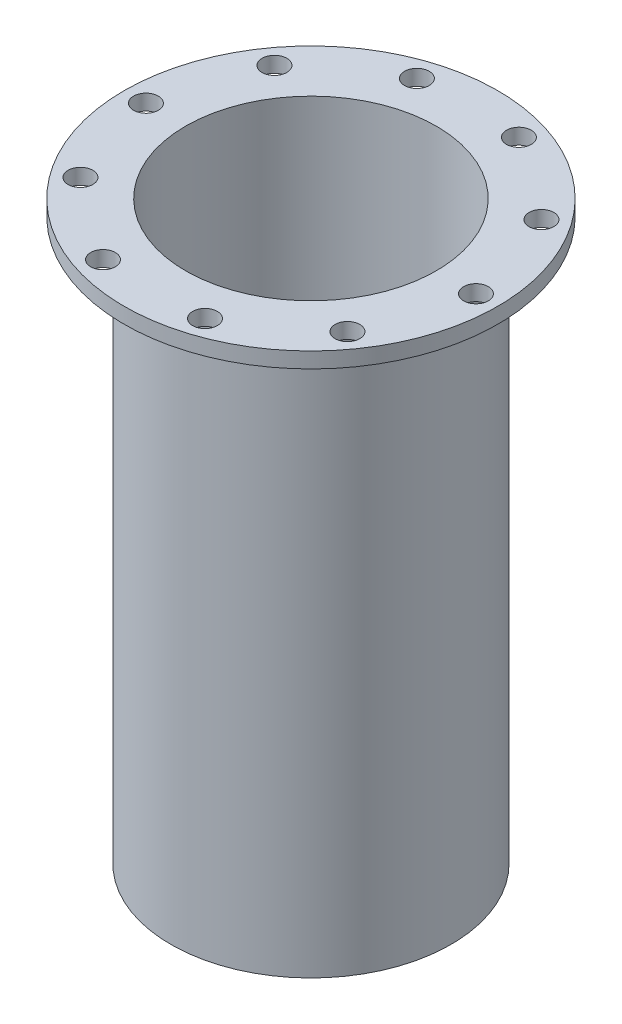
ISO-10303-21;
HEADER;
FILE_DESCRIPTION(('STEP AP214'),'2;1');
FILE_NAME('part.step','',(''),(''),'','','');
FILE_SCHEMA(('AUTOMOTIVE_DESIGN { 1 0 10303 214 1 1 1 1 }'));
ENDSEC;
DATA;
#1=APPLICATION_CONTEXT('core data for automotive mechanical design processes');
#2=APPLICATION_PROTOCOL_DEFINITION('international standard','automotive_design',2000,#1);
#3=PRODUCT_CONTEXT('',#1,'mechanical');
#4=PRODUCT('Part','Part','',(#3));
#5=PRODUCT_RELATED_PRODUCT_CATEGORY('part','',(#4));
#6=PRODUCT_DEFINITION_FORMATION('','',#4);
#7=PRODUCT_DEFINITION_CONTEXT('part definition',#1,'design');
#8=PRODUCT_DEFINITION('design','',#6,#7);
#9=PRODUCT_DEFINITION_SHAPE('','',#8);
#10=(LENGTH_UNIT() NAMED_UNIT(*) SI_UNIT(.MILLI.,.METRE.));
#11=(NAMED_UNIT(*) PLANE_ANGLE_UNIT() SI_UNIT($,.RADIAN.));
#12=(NAMED_UNIT(*) SI_UNIT($,.STERADIAN.) SOLID_ANGLE_UNIT());
#13=UNCERTAINTY_MEASURE_WITH_UNIT(LENGTH_MEASURE(1.E-05),#10,'distance_accuracy_value','');
#14=(GEOMETRIC_REPRESENTATION_CONTEXT(3) GLOBAL_UNCERTAINTY_ASSIGNED_CONTEXT((#13)) GLOBAL_UNIT_ASSIGNED_CONTEXT((#10,
#11,#12)) REPRESENTATION_CONTEXT('',''));
#15=CARTESIAN_POINT('',(0.,0.,0.));
#16=DIRECTION('',(0.,0.,1.));
#17=DIRECTION('',(1.,0.,0.));
#18=AXIS2_PLACEMENT_3D('',#15,#16,#17);
#19=CARTESIAN_POINT('',(76.2,1.25806636316965E-13,0.));
#20=DIRECTION('',(0.,-1.,0.));
#21=DIRECTION('',(1.,0.,0.));
#22=AXIS2_PLACEMENT_3D('',#19,#20,#21);
#23=PLANE('',#22);
#24=CARTESIAN_POINT('',(54.4549338913782,5.66939445869481E-13,39.5638253318057));
#25=DIRECTION('',(0.,1.,0.));
#26=DIRECTION('',(0.,0.,1.));
#27=AXIS2_PLACEMENT_3D('',#24,#25,#26);
#28=CIRCLE('',#27,5.04189999999997);
#29=CARTESIAN_POINT('',(54.4549338913782,5.66939445869481E-13,44.6057253318056));
#30=VERTEX_POINT('',#29);
#31=EDGE_CURVE('E235',#30,#30,#28,.T.);
#32=ORIENTED_EDGE('',*,*,#31,.F.);
#33=EDGE_LOOP('',(#32));
#34=FACE_BOUND('',#33,.T.);
#35=CARTESIAN_POINT('',(20.7999338913784,2.16470374895981E-13,64.0156141118266));
#36=DIRECTION('',(0.,1.,0.));
#37=DIRECTION('',(0.,0.,1.));
#38=AXIS2_PLACEMENT_3D('',#35,#36,#37);
#39=CIRCLE('',#38,5.04189999999997);
#40=CARTESIAN_POINT('',(20.7999338913784,2.16470374895981E-13,69.0575141118265));
#41=VERTEX_POINT('',#40);
#42=EDGE_CURVE('E95',#41,#41,#39,.T.);
#43=ORIENTED_EDGE('',*,*,#42,.F.);
#44=EDGE_LOOP('',(#43));
#45=FACE_BOUND('',#44,.T.);
#46=CARTESIAN_POINT('',(-54.4549338913774,-5.67202291811973E-13,39.5638253318068));
#47=DIRECTION('',(0.,1.,0.));
#48=DIRECTION('',(0.,0.,1.));
#49=AXIS2_PLACEMENT_3D('',#46,#47,#48);
#50=CIRCLE('',#49,5.04189999999997);
#51=CARTESIAN_POINT('',(-54.4549338913774,-5.67202291811973E-13,44.6057253318068));
#52=VERTEX_POINT('',#51);
#53=EDGE_CURVE('E77',#52,#52,#50,.T.);
#54=ORIENTED_EDGE('',*,*,#53,.F.);
#55=EDGE_LOOP('',(#54));
#56=FACE_BOUND('',#55,.T.);
#57=CARTESIAN_POINT('',(-67.31,-7.01069564918256E-13,0.));
#58=DIRECTION('',(0.,1.,0.));
#59=DIRECTION('',(0.,0.,1.));
#60=AXIS2_PLACEMENT_3D('',#57,#58,#59);
#61=CIRCLE('',#60,5.04189999999997);
#62=CARTESIAN_POINT('',(-67.31,-7.01069564918256E-13,5.04189999999997));
#63=VERTEX_POINT('',#62);
#64=EDGE_CURVE('E73',#63,#63,#61,.T.);
#65=ORIENTED_EDGE('',*,*,#64,.F.);
#66=EDGE_LOOP('',(#65));
#67=FACE_BOUND('',#66,.T.);
#68=CARTESIAN_POINT('',(-54.4549338913779,-5.67202291811979E-13,-39.5638253318061));
#69=DIRECTION('',(0.,1.,0.));
#70=DIRECTION('',(0.,0.,1.));
#71=AXIS2_PLACEMENT_3D('',#68,#69,#70);
#72=CIRCLE('',#71,5.04189999999997);
#73=CARTESIAN_POINT('',(-54.4549338913779,-5.67202291811979E-13,-34.5219253318061));
#74=VERTEX_POINT('',#73);
#75=EDGE_CURVE('E69',#74,#74,#72,.T.);
#76=ORIENTED_EDGE('',*,*,#75,.F.);
#77=EDGE_LOOP('',(#76));
#78=FACE_BOUND('',#77,.T.);
#79=CARTESIAN_POINT('',(-20.799933891378,-2.16733220838477E-13,-64.0156141118267));
#80=DIRECTION('',(0.,1.,0.));
#81=DIRECTION('',(0.,0.,1.));
#82=AXIS2_PLACEMENT_3D('',#79,#80,#81);
#83=CIRCLE('',#82,5.04189999999997);
#84=CARTESIAN_POINT('',(-20.799933891378,-2.16733220838477E-13,-58.9737141118267));
#85=VERTEX_POINT('',#84);
#86=EDGE_CURVE('E68',#85,#85,#83,.T.);
#87=ORIENTED_EDGE('',*,*,#86,.F.);
#88=EDGE_LOOP('',(#87));
#89=FACE_BOUND('',#88,.T.);
#90=CARTESIAN_POINT('',(20.7999338913775,2.16470374895971E-13,-64.0156141118268));
#91=DIRECTION('',(0.,1.,0.));
#92=DIRECTION('',(0.,0.,1.));
#93=AXIS2_PLACEMENT_3D('',#90,#91,#92);
#94=CIRCLE('',#93,5.04189999999997);
#95=CARTESIAN_POINT('',(20.7999338913775,2.16470374895971E-13,-58.9737141118269));
#96=VERTEX_POINT('',#95);
#97=EDGE_CURVE('E110',#96,#96,#94,.T.);
#98=ORIENTED_EDGE('',*,*,#97,.F.);
#99=EDGE_LOOP('',(#98));
#100=FACE_BOUND('',#99,.T.);
#101=CARTESIAN_POINT('',(54.4549338913777,5.66939445869475E-13,-39.5638253318064));
#102=DIRECTION('',(0.,1.,0.));
#103=DIRECTION('',(0.,0.,1.));
#104=AXIS2_PLACEMENT_3D('',#101,#102,#103);
#105=CIRCLE('',#104,5.04189999999997);
#106=CARTESIAN_POINT('',(54.4549338913777,5.66939445869475E-13,-34.5219253318065));
#107=VERTEX_POINT('',#106);
#108=EDGE_CURVE('E63',#107,#107,#105,.T.);
#109=ORIENTED_EDGE('',*,*,#108,.F.);
#110=EDGE_LOOP('',(#109));
#111=FACE_BOUND('',#110,.T.);
#112=CARTESIAN_POINT('',(67.31,7.00806718975755E-13,0.));
#113=DIRECTION('',(0.,1.,0.));
#114=DIRECTION('',(0.,0.,1.));
#115=AXIS2_PLACEMENT_3D('',#112,#113,#114);
#116=CIRCLE('',#115,5.04189999999997);
#117=CARTESIAN_POINT('',(67.31,7.00806718975755E-13,5.04189999999997));
#118=VERTEX_POINT('',#117);
#119=EDGE_CURVE('E62',#118,#118,#116,.T.);
#120=ORIENTED_EDGE('',*,*,#119,.F.);
#121=EDGE_LOOP('',(#120));
#122=FACE_BOUND('',#121,.T.);
#123=CARTESIAN_POINT('',(0.,-5.38710126497475E-13,0.));
#124=DIRECTION('',(0.,1.,0.));
#125=DIRECTION('',(-1.,0.,0.));
#126=AXIS2_PLACEMENT_3D('',#123,#124,#125);
#127=CIRCLE('',#126,51.1302);
#128=CARTESIAN_POINT('',(-51.1302,-1.07115860941797E-12,0.));
#129=VERTEX_POINT('',#128);
#130=EDGE_CURVE('E10',#129,#129,#127,.T.);
#131=ORIENTED_EDGE('',*,*,#130,.F.);
#132=EDGE_LOOP('',(#131));
#133=FACE_BOUND('',#132,.T.);
#134=CARTESIAN_POINT('',(0.,-7.96706356220305E-13,0.));
#135=DIRECTION('',(0.,1.,0.));
#136=DIRECTION('',(-1.,0.,0.));
#137=AXIS2_PLACEMENT_3D('',#134,#135,#136);
#138=CIRCLE('',#137,76.2);
#139=CARTESIAN_POINT('',(-76.2,-1.59022123389616E-12,0.));
#140=VERTEX_POINT('',#139);
#141=EDGE_CURVE('E124',#140,#140,#138,.T.);
#142=ORIENTED_EDGE('',*,*,#141,.T.);
#143=EDGE_LOOP('',(#142));
#144=FACE_BOUND('',#143,.T.);
#145=CARTESIAN_POINT('',(-20.7999338913771,-2.16733220838468E-13,64.015614111827));
#146=DIRECTION('',(0.,1.,0.));
#147=DIRECTION('',(0.,0.,1.));
#148=AXIS2_PLACEMENT_3D('',#145,#146,#147);
#149=CIRCLE('',#148,5.04189999999997);
#150=CARTESIAN_POINT('',(-20.7999338913771,-2.16733220838468E-13,69.0575141118269));
#151=VERTEX_POINT('',#150);
#152=EDGE_CURVE('E81',#151,#151,#149,.T.);
#153=ORIENTED_EDGE('',*,*,#152,.F.);
#154=EDGE_LOOP('',(#153));
#155=FACE_BOUND('',#154,.T.);
#156=ADVANCED_FACE('F41',(#34,#45,#56,#67,#78,#89,#100,#111,#122,#133,#144,#155),#23,.F.);
#157=CARTESIAN_POINT('',(0.,0.,0.));
#158=DIRECTION('',(0.,1.,0.));
#159=DIRECTION('',(-1.,0.,0.));
#160=AXIS2_PLACEMENT_3D('',#157,#158,#159);
#161=CYLINDRICAL_SURFACE('',#160,51.1301999999989);
#162=CARTESIAN_POINT('',(2.29458052127936E-12,-220.345000000001,0.));
#163=DIRECTION('',(0.,1.,0.));
#164=DIRECTION('',(-1.,0.,0.));
#165=AXIS2_PLACEMENT_3D('',#162,#163,#164);
#166=CIRCLE('',#165,51.1301999999977);
#167=CARTESIAN_POINT('',(-51.1301999999954,-220.345000000002,0.));
#168=VERTEX_POINT('',#167);
#169=EDGE_CURVE('E49',#168,#168,#166,.T.);
#170=ORIENTED_EDGE('',*,*,#169,.F.);
#171=EDGE_LOOP('',(#170));
#172=FACE_BOUND('',#171,.T.);
#173=ORIENTED_EDGE('',*,*,#130,.T.);
#174=EDGE_LOOP('',(#173));
#175=FACE_BOUND('',#174,.T.);
#176=ADVANCED_FACE('F155',(#172,#175),#161,.F.);
#177=CARTESIAN_POINT('',(51.1302,-220.345000000001,0.));
#178=DIRECTION('',(0.,1.,0.));
#179=DIRECTION('',(-1.,0.,0.));
#180=AXIS2_PLACEMENT_3D('',#177,#178,#179);
#181=PLANE('',#180);
#182=CARTESIAN_POINT('',(2.29458052127936E-12,-220.345000000001,0.));
#183=DIRECTION('',(0.,1.,0.));
#184=DIRECTION('',(-1.,0.,0.));
#185=AXIS2_PLACEMENT_3D('',#182,#183,#184);
#186=CIRCLE('',#185,53.6701999999977);
#187=CARTESIAN_POINT('',(-53.6701999999954,-220.345000000002,0.));
#188=VERTEX_POINT('',#187);
#189=EDGE_CURVE('E55',#188,#188,#186,.T.);
#190=ORIENTED_EDGE('',*,*,#189,.F.);
#191=EDGE_LOOP('',(#190));
#192=FACE_BOUND('',#191,.T.);
#193=ORIENTED_EDGE('',*,*,#169,.T.);
#194=EDGE_LOOP('',(#193));
#195=FACE_BOUND('',#194,.T.);
#196=ADVANCED_FACE('F152',(#192,#195),#181,.F.);
#197=CARTESIAN_POINT('',(0.,0.,0.));
#198=DIRECTION('',(0.,1.,0.));
#199=DIRECTION('',(-1.,0.,0.));
#200=AXIS2_PLACEMENT_3D('',#197,#198,#199);
#201=CYLINDRICAL_SURFACE('',#200,53.6701999999977);
#202=CARTESIAN_POINT('',(2.3263211163864E-12,-223.393000000001,0.));
#203=DIRECTION('',(0.,1.,0.));
#204=DIRECTION('',(-1.,0.,0.));
#205=AXIS2_PLACEMENT_3D('',#202,#203,#204);
#206=CIRCLE('',#205,53.6701999999977);
#207=CARTESIAN_POINT('',(-53.6701999999954,-223.393000000002,0.));
#208=VERTEX_POINT('',#207);
#209=EDGE_CURVE('E145',#208,#208,#206,.T.);
#210=ORIENTED_EDGE('',*,*,#209,.F.);
#211=EDGE_LOOP('',(#210));
#212=FACE_BOUND('',#211,.T.);
#213=ORIENTED_EDGE('',*,*,#189,.T.);
#214=EDGE_LOOP('',(#213));
#215=FACE_BOUND('',#214,.T.);
#216=ADVANCED_FACE('F150',(#212,#215),#201,.F.);
#217=CARTESIAN_POINT('',(53.6702,-223.393000000001,0.));
#218=DIRECTION('',(0.,-1.,0.));
#219=DIRECTION('',(1.,0.,0.));
#220=AXIS2_PLACEMENT_3D('',#217,#218,#219);
#221=PLANE('',#220);
#222=CARTESIAN_POINT('',(2.3263211163864E-12,-223.393000000001,0.));
#223=DIRECTION('',(0.,1.,0.));
#224=DIRECTION('',(-1.,0.,0.));
#225=AXIS2_PLACEMENT_3D('',#222,#223,#224);
#226=CIRCLE('',#225,51.1301999999977);
#227=CARTESIAN_POINT('',(-51.1301999999954,-223.393000000002,0.));
#228=VERTEX_POINT('',#227);
#229=EDGE_CURVE('E142',#228,#228,#226,.T.);
#230=ORIENTED_EDGE('',*,*,#229,.F.);
#231=EDGE_LOOP('',(#230));
#232=FACE_BOUND('',#231,.T.);
#233=ORIENTED_EDGE('',*,*,#209,.T.);
#234=EDGE_LOOP('',(#233));
#235=FACE_BOUND('',#234,.T.);
#236=ADVANCED_FACE('F167',(#232,#235),#221,.F.);
#237=CARTESIAN_POINT('',(0.,0.,0.));
#238=DIRECTION('',(0.,1.,0.));
#239=DIRECTION('',(-1.,0.,0.));
#240=AXIS2_PLACEMENT_3D('',#237,#238,#239);
#241=CYLINDRICAL_SURFACE('',#240,51.1301999999976);
#242=CARTESIAN_POINT('',(2.44667087283389E-12,-234.950000000001,0.));
#243=DIRECTION('',(0.,1.,0.));
#244=DIRECTION('',(-1.,0.,0.));
#245=AXIS2_PLACEMENT_3D('',#242,#243,#244);
#246=CIRCLE('',#245,51.1301999999976);
#247=CARTESIAN_POINT('',(-51.1301999999951,-234.950000000001,0.));
#248=VERTEX_POINT('',#247);
#249=EDGE_CURVE('E139',#248,#248,#246,.T.);
#250=ORIENTED_EDGE('',*,*,#249,.F.);
#251=EDGE_LOOP('',(#250));
#252=FACE_BOUND('',#251,.T.);
#253=ORIENTED_EDGE('',*,*,#229,.T.);
#254=EDGE_LOOP('',(#253));
#255=FACE_BOUND('',#254,.T.);
#256=ADVANCED_FACE('F171',(#252,#255),#241,.F.);
#257=CARTESIAN_POINT('',(51.1302,-234.95,0.));
#258=DIRECTION('',(0.,1.,0.));
#259=DIRECTION('',(-1.,0.,0.));
#260=AXIS2_PLACEMENT_3D('',#257,#258,#259);
#261=PLANE('',#260);
#262=CARTESIAN_POINT('',(2.44667087283389E-12,-234.950000000001,0.));
#263=DIRECTION('',(0.,1.,0.));
#264=DIRECTION('',(-1.,0.,0.));
#265=AXIS2_PLACEMENT_3D('',#262,#263,#264);
#266=CIRCLE('',#265,57.1499999999976);
#267=CARTESIAN_POINT('',(-57.1499999999951,-234.950000000001,0.));
#268=VERTEX_POINT('',#267);
#269=EDGE_CURVE('E136',#268,#268,#266,.T.);
#270=ORIENTED_EDGE('',*,*,#269,.F.);
#271=EDGE_LOOP('',(#270));
#272=FACE_BOUND('',#271,.T.);
#273=ORIENTED_EDGE('',*,*,#249,.T.);
#274=EDGE_LOOP('',(#273));
#275=FACE_BOUND('',#274,.T.);
#276=ADVANCED_FACE('F175',(#272,#275),#261,.F.);
#277=CARTESIAN_POINT('',(0.,0.,0.));
#278=DIRECTION('',(0.,1.,0.));
#279=DIRECTION('',(-1.,0.,0.));
#280=AXIS2_PLACEMENT_3D('',#277,#278,#279);
#281=CYLINDRICAL_SURFACE('',#280,57.1499999999988);
#282=CARTESIAN_POINT('',(0.,-6.3500000000006,0.));
#283=DIRECTION('',(0.,1.,0.));
#284=DIRECTION('',(-1.,0.,0.));
#285=AXIS2_PLACEMENT_3D('',#282,#283,#284);
#286=CIRCLE('',#285,57.1499999999999);
#287=CARTESIAN_POINT('',(-57.1499999999999,-6.35000000000119,0.));
#288=VERTEX_POINT('',#287);
#289=EDGE_CURVE('E132',#288,#288,#286,.T.);
#290=ORIENTED_EDGE('',*,*,#289,.F.);
#291=EDGE_LOOP('',(#290));
#292=FACE_BOUND('',#291,.T.);
#293=ORIENTED_EDGE('',*,*,#269,.T.);
#294=EDGE_LOOP('',(#293));
#295=FACE_BOUND('',#294,.T.);
#296=ADVANCED_FACE('F179',(#292,#295),#281,.T.);
#297=CARTESIAN_POINT('',(57.15,-6.3500000000001,0.));
#298=DIRECTION('',(0.,1.,0.));
#299=DIRECTION('',(-1.,0.,0.));
#300=AXIS2_PLACEMENT_3D('',#297,#298,#299);
#301=PLANE('',#300);
#302=CARTESIAN_POINT('',(54.4549338913782,-6.35000000000013,39.5638253318057));
#303=DIRECTION('',(0.,1.,0.));
#304=DIRECTION('',(-1.,0.,0.));
#305=AXIS2_PLACEMENT_3D('',#302,#303,#304);
#306=CIRCLE('',#305,5.04189999999995);
#307=CARTESIAN_POINT('',(49.4130338913783,-6.35000000000018,39.5638253318057));
#308=VERTEX_POINT('',#307);
#309=EDGE_CURVE('E44',#308,#308,#306,.T.);
#310=ORIENTED_EDGE('',*,*,#309,.T.);
#311=EDGE_LOOP('',(#310));
#312=FACE_BOUND('',#311,.T.);
#313=CARTESIAN_POINT('',(20.7999338913784,-6.35000000000048,64.0156141118266));
#314=DIRECTION('',(0.,1.,0.));
#315=DIRECTION('',(-1.,0.,0.));
#316=AXIS2_PLACEMENT_3D('',#313,#314,#315);
#317=CIRCLE('',#316,5.04189999999995);
#318=CARTESIAN_POINT('',(15.7580338913785,-6.35000000000053,64.0156141118266));
#319=VERTEX_POINT('',#318);
#320=EDGE_CURVE('E90',#319,#319,#317,.T.);
#321=ORIENTED_EDGE('',*,*,#320,.T.);
#322=EDGE_LOOP('',(#321));
#323=FACE_BOUND('',#322,.T.);
#324=CARTESIAN_POINT('',(-20.7999338913771,-6.35000000000091,64.015614111827));
#325=DIRECTION('',(0.,1.,0.));
#326=DIRECTION('',(-1.,0.,0.));
#327=AXIS2_PLACEMENT_3D('',#324,#325,#326);
#328=CIRCLE('',#327,5.04189999999995);
#329=CARTESIAN_POINT('',(-25.841833891377,-6.35000000000097,64.015614111827));
#330=VERTEX_POINT('',#329);
#331=EDGE_CURVE('E78',#330,#330,#328,.T.);
#332=ORIENTED_EDGE('',*,*,#331,.T.);
#333=EDGE_LOOP('',(#332));
#334=FACE_BOUND('',#333,.T.);
#335=CARTESIAN_POINT('',(-54.4549338913774,-6.35000000000126,39.5638253318068));
#336=DIRECTION('',(0.,1.,0.));
#337=DIRECTION('',(-1.,0.,0.));
#338=AXIS2_PLACEMENT_3D('',#335,#336,#337);
#339=CIRCLE('',#338,5.04189999999995);
#340=CARTESIAN_POINT('',(-59.4968338913773,-6.35000000000132,39.5638253318068));
#341=VERTEX_POINT('',#340);
#342=EDGE_CURVE('E74',#341,#341,#339,.T.);
#343=ORIENTED_EDGE('',*,*,#342,.T.);
#344=EDGE_LOOP('',(#343));
#345=FACE_BOUND('',#344,.T.);
#346=CARTESIAN_POINT('',(-67.31,-6.3500000000014,0.));
#347=DIRECTION('',(0.,1.,0.));
#348=DIRECTION('',(-1.,0.,0.));
#349=AXIS2_PLACEMENT_3D('',#346,#347,#348);
#350=CIRCLE('',#349,5.04189999999995);
#351=CARTESIAN_POINT('',(-72.3518999999999,-6.35000000000145,0.));
#352=VERTEX_POINT('',#351);
#353=EDGE_CURVE('E70',#352,#352,#350,.T.);
#354=ORIENTED_EDGE('',*,*,#353,.T.);
#355=EDGE_LOOP('',(#354));
#356=FACE_BOUND('',#355,.T.);
#357=CARTESIAN_POINT('',(-54.4549338913779,-6.35000000000126,-39.5638253318061));
#358=DIRECTION('',(0.,1.,0.));
#359=DIRECTION('',(-1.,0.,0.));
#360=AXIS2_PLACEMENT_3D('',#357,#358,#359);
#361=CIRCLE('',#360,5.04189999999995);
#362=CARTESIAN_POINT('',(-59.4968338913779,-6.35000000000132,-39.5638253318061));
#363=VERTEX_POINT('',#362);
#364=EDGE_CURVE('E64',#363,#363,#361,.T.);
#365=ORIENTED_EDGE('',*,*,#364,.T.);
#366=EDGE_LOOP('',(#365));
#367=FACE_BOUND('',#366,.T.);
#368=CARTESIAN_POINT('',(-20.799933891378,-6.35000000000091,-64.0156141118267));
#369=DIRECTION('',(0.,1.,0.));
#370=DIRECTION('',(-1.,0.,0.));
#371=AXIS2_PLACEMENT_3D('',#368,#369,#370);
#372=CIRCLE('',#371,5.04189999999995);
#373=CARTESIAN_POINT('',(-25.8418338913779,-6.35000000000097,-64.0156141118267));
#374=VERTEX_POINT('',#373);
#375=EDGE_CURVE('E106',#374,#374,#372,.T.);
#376=ORIENTED_EDGE('',*,*,#375,.T.);
#377=EDGE_LOOP('',(#376));
#378=FACE_BOUND('',#377,.T.);
#379=CARTESIAN_POINT('',(20.7999338913775,-6.35000000000048,-64.0156141118268));
#380=DIRECTION('',(0.,1.,0.));
#381=DIRECTION('',(-1.,0.,0.));
#382=AXIS2_PLACEMENT_3D('',#379,#380,#381);
#383=CIRCLE('',#382,5.04189999999995);
#384=CARTESIAN_POINT('',(15.7580338913776,-6.35000000000053,-64.0156141118268));
#385=VERTEX_POINT('',#384);
#386=EDGE_CURVE('E113',#385,#385,#383,.T.);
#387=ORIENTED_EDGE('',*,*,#386,.T.);
#388=EDGE_LOOP('',(#387));
#389=FACE_BOUND('',#388,.T.);
#390=CARTESIAN_POINT('',(54.4549338913777,-6.35000000000013,-39.5638253318064));
#391=DIRECTION('',(0.,1.,0.));
#392=DIRECTION('',(-1.,0.,0.));
#393=AXIS2_PLACEMENT_3D('',#390,#391,#392);
#394=CIRCLE('',#393,5.04189999999995);
#395=CARTESIAN_POINT('',(49.4130338913777,-6.35000000000018,-39.5638253318064));
#396=VERTEX_POINT('',#395);
#397=EDGE_CURVE('E59',#396,#396,#394,.T.);
#398=ORIENTED_EDGE('',*,*,#397,.T.);
#399=EDGE_LOOP('',(#398));
#400=FACE_BOUND('',#399,.T.);
#401=CARTESIAN_POINT('',(67.31,-6.35,0.));
#402=DIRECTION('',(0.,1.,0.));
#403=DIRECTION('',(-1.,0.,0.));
#404=AXIS2_PLACEMENT_3D('',#401,#402,#403);
#405=CIRCLE('',#404,5.04189999999996);
#406=CARTESIAN_POINT('',(62.2681,-6.35000000000005,0.));
#407=VERTEX_POINT('',#406);
#408=EDGE_CURVE('E120',#407,#407,#405,.T.);
#409=ORIENTED_EDGE('',*,*,#408,.T.);
#410=EDGE_LOOP('',(#409));
#411=FACE_BOUND('',#410,.T.);
#412=CARTESIAN_POINT('',(0.,-6.3500000000008,0.));
#413=DIRECTION('',(0.,1.,0.));
#414=DIRECTION('',(-1.,0.,0.));
#415=AXIS2_PLACEMENT_3D('',#412,#413,#414);
#416=CIRCLE('',#415,76.1999999999999);
#417=CARTESIAN_POINT('',(-76.1999999999999,-6.35000000000159,0.));
#418=VERTEX_POINT('',#417);
#419=EDGE_CURVE('E128',#418,#418,#416,.T.);
#420=ORIENTED_EDGE('',*,*,#419,.F.);
#421=EDGE_LOOP('',(#420));
#422=FACE_BOUND('',#421,.T.);
#423=ORIENTED_EDGE('',*,*,#289,.T.);
#424=EDGE_LOOP('',(#423));
#425=FACE_BOUND('',#424,.T.);
#426=ADVANCED_FACE('F183',(#312,#323,#334,#345,#356,#367,#378,#389,#400,#411,#422,#425),#301,.F.);
#427=CARTESIAN_POINT('',(0.,0.,0.));
#428=DIRECTION('',(0.,1.,0.));
#429=DIRECTION('',(-1.,0.,0.));
#430=AXIS2_PLACEMENT_3D('',#427,#428,#429);
#431=CYLINDRICAL_SURFACE('',#430,76.2);
#432=ORIENTED_EDGE('',*,*,#141,.F.);
#433=EDGE_LOOP('',(#432));
#434=FACE_BOUND('',#433,.T.);
#435=ORIENTED_EDGE('',*,*,#419,.T.);
#436=EDGE_LOOP('',(#435));
#437=FACE_BOUND('',#436,.T.);
#438=ADVANCED_FACE('F187',(#434,#437),#431,.T.);
#439=CARTESIAN_POINT('',(67.31,7.00938141947005E-13,0.));
#440=DIRECTION('',(0.,1.,0.));
#441=DIRECTION('',(0.,0.,1.));
#442=AXIS2_PLACEMENT_3D('',#439,#440,#441);
#443=CYLINDRICAL_SURFACE('',#442,5.04189999999996);
#444=ORIENTED_EDGE('',*,*,#119,.T.);
#445=EDGE_LOOP('',(#444));
#446=FACE_BOUND('',#445,.T.);
#447=ORIENTED_EDGE('',*,*,#408,.F.);
#448=EDGE_LOOP('',(#447));
#449=FACE_BOUND('',#448,.T.);
#450=ADVANCED_FACE('F191',(#446,#449),#443,.F.);
#451=CARTESIAN_POINT('',(54.4549338913777,5.67070868840726E-13,-39.5638253318064));
#452=DIRECTION('',(0.,1.,0.));
#453=DIRECTION('',(0.,0.,1.));
#454=AXIS2_PLACEMENT_3D('',#451,#452,#453);
#455=CYLINDRICAL_SURFACE('',#454,5.04189999999995);
#456=ORIENTED_EDGE('',*,*,#108,.T.);
#457=EDGE_LOOP('',(#456));
#458=FACE_BOUND('',#457,.T.);
#459=ORIENTED_EDGE('',*,*,#397,.F.);
#460=EDGE_LOOP('',(#459));
#461=FACE_BOUND('',#460,.T.);
#462=ADVANCED_FACE('F195',(#458,#461),#455,.F.);
#463=CARTESIAN_POINT('',(20.7999338913775,2.16601797867222E-13,-64.0156141118268));
#464=DIRECTION('',(0.,1.,0.));
#465=DIRECTION('',(0.,0.,1.));
#466=AXIS2_PLACEMENT_3D('',#463,#464,#465);
#467=CYLINDRICAL_SURFACE('',#466,5.04189999999995);
#468=ORIENTED_EDGE('',*,*,#97,.T.);
#469=EDGE_LOOP('',(#468));
#470=FACE_BOUND('',#469,.T.);
#471=ORIENTED_EDGE('',*,*,#386,.F.);
#472=EDGE_LOOP('',(#471));
#473=FACE_BOUND('',#472,.T.);
#474=ADVANCED_FACE('F199',(#470,#473),#467,.F.);
#475=CARTESIAN_POINT('',(-20.799933891378,-2.16601797867227E-13,-64.0156141118267));
#476=DIRECTION('',(0.,1.,0.));
#477=DIRECTION('',(0.,0.,1.));
#478=AXIS2_PLACEMENT_3D('',#475,#476,#477);
#479=CYLINDRICAL_SURFACE('',#478,5.04189999999995);
#480=ORIENTED_EDGE('',*,*,#86,.T.);
#481=EDGE_LOOP('',(#480));
#482=FACE_BOUND('',#481,.T.);
#483=ORIENTED_EDGE('',*,*,#375,.F.);
#484=EDGE_LOOP('',(#483));
#485=FACE_BOUND('',#484,.T.);
#486=ADVANCED_FACE('F203',(#482,#485),#479,.F.);
#487=CARTESIAN_POINT('',(-54.4549338913779,-5.67070868840729E-13,-39.5638253318061));
#488=DIRECTION('',(0.,1.,0.));
#489=DIRECTION('',(0.,0.,1.));
#490=AXIS2_PLACEMENT_3D('',#487,#488,#489);
#491=CYLINDRICAL_SURFACE('',#490,5.04189999999995);
#492=ORIENTED_EDGE('',*,*,#75,.T.);
#493=EDGE_LOOP('',(#492));
#494=FACE_BOUND('',#493,.T.);
#495=ORIENTED_EDGE('',*,*,#364,.F.);
#496=EDGE_LOOP('',(#495));
#497=FACE_BOUND('',#496,.T.);
#498=ADVANCED_FACE('F207',(#494,#497),#491,.F.);
#499=CARTESIAN_POINT('',(-67.31,-7.00938141947005E-13,0.));
#500=DIRECTION('',(0.,1.,0.));
#501=DIRECTION('',(0.,0.,1.));
#502=AXIS2_PLACEMENT_3D('',#499,#500,#501);
#503=CYLINDRICAL_SURFACE('',#502,5.04189999999995);
#504=ORIENTED_EDGE('',*,*,#64,.T.);
#505=EDGE_LOOP('',(#504));
#506=FACE_BOUND('',#505,.T.);
#507=ORIENTED_EDGE('',*,*,#353,.F.);
#508=EDGE_LOOP('',(#507));
#509=FACE_BOUND('',#508,.T.);
#510=ADVANCED_FACE('F211',(#506,#509),#503,.F.);
#511=CARTESIAN_POINT('',(-54.4549338913774,-5.67070868840723E-13,39.5638253318068));
#512=DIRECTION('',(0.,1.,0.));
#513=DIRECTION('',(0.,0.,1.));
#514=AXIS2_PLACEMENT_3D('',#511,#512,#513);
#515=CYLINDRICAL_SURFACE('',#514,5.04189999999995);
#516=ORIENTED_EDGE('',*,*,#53,.T.);
#517=EDGE_LOOP('',(#516));
#518=FACE_BOUND('',#517,.T.);
#519=ORIENTED_EDGE('',*,*,#342,.F.);
#520=EDGE_LOOP('',(#519));
#521=FACE_BOUND('',#520,.T.);
#522=ADVANCED_FACE('F215',(#518,#521),#515,.F.);
#523=CARTESIAN_POINT('',(-20.7999338913771,-2.16601797867217E-13,64.015614111827));
#524=DIRECTION('',(0.,1.,0.));
#525=DIRECTION('',(0.,0.,1.));
#526=AXIS2_PLACEMENT_3D('',#523,#524,#525);
#527=CYLINDRICAL_SURFACE('',#526,5.04189999999995);
#528=ORIENTED_EDGE('',*,*,#152,.T.);
#529=EDGE_LOOP('',(#528));
#530=FACE_BOUND('',#529,.T.);
#531=ORIENTED_EDGE('',*,*,#331,.F.);
#532=EDGE_LOOP('',(#531));
#533=FACE_BOUND('',#532,.T.);
#534=ADVANCED_FACE('F219',(#530,#533),#527,.F.);
#535=CARTESIAN_POINT('',(20.7999338913784,2.16601797867231E-13,64.0156141118266));
#536=DIRECTION('',(0.,1.,0.));
#537=DIRECTION('',(0.,0.,1.));
#538=AXIS2_PLACEMENT_3D('',#535,#536,#537);
#539=CYLINDRICAL_SURFACE('',#538,5.04189999999995);
#540=ORIENTED_EDGE('',*,*,#42,.T.);
#541=EDGE_LOOP('',(#540));
#542=FACE_BOUND('',#541,.T.);
#543=ORIENTED_EDGE('',*,*,#320,.F.);
#544=EDGE_LOOP('',(#543));
#545=FACE_BOUND('',#544,.T.);
#546=ADVANCED_FACE('F223',(#542,#545),#539,.F.);
#547=CARTESIAN_POINT('',(54.4549338913782,5.67070868840732E-13,39.5638253318057));
#548=DIRECTION('',(0.,1.,0.));
#549=DIRECTION('',(0.,0.,1.));
#550=AXIS2_PLACEMENT_3D('',#547,#548,#549);
#551=CYLINDRICAL_SURFACE('',#550,5.04189999999995);
#552=ORIENTED_EDGE('',*,*,#31,.T.);
#553=EDGE_LOOP('',(#552));
#554=FACE_BOUND('',#553,.T.);
#555=ORIENTED_EDGE('',*,*,#309,.F.);
#556=EDGE_LOOP('',(#555));
#557=FACE_BOUND('',#556,.T.);
#558=ADVANCED_FACE('F226',(#554,#557),#551,.F.);
#559=CLOSED_SHELL('',(#156,#176,#196,#216,#236,#256,#276,#296,#426,#438,#450,#462,#474,#486,
#498,#510,#522,#534,#546,#558));
#560=MANIFOLD_SOLID_BREP('B2',#559);
#561=ADVANCED_BREP_SHAPE_REPRESENTATION('',(#18,#560),#14);
#562=SHAPE_DEFINITION_REPRESENTATION(#9,#561);
ENDSEC;
END-ISO-10303-21;
